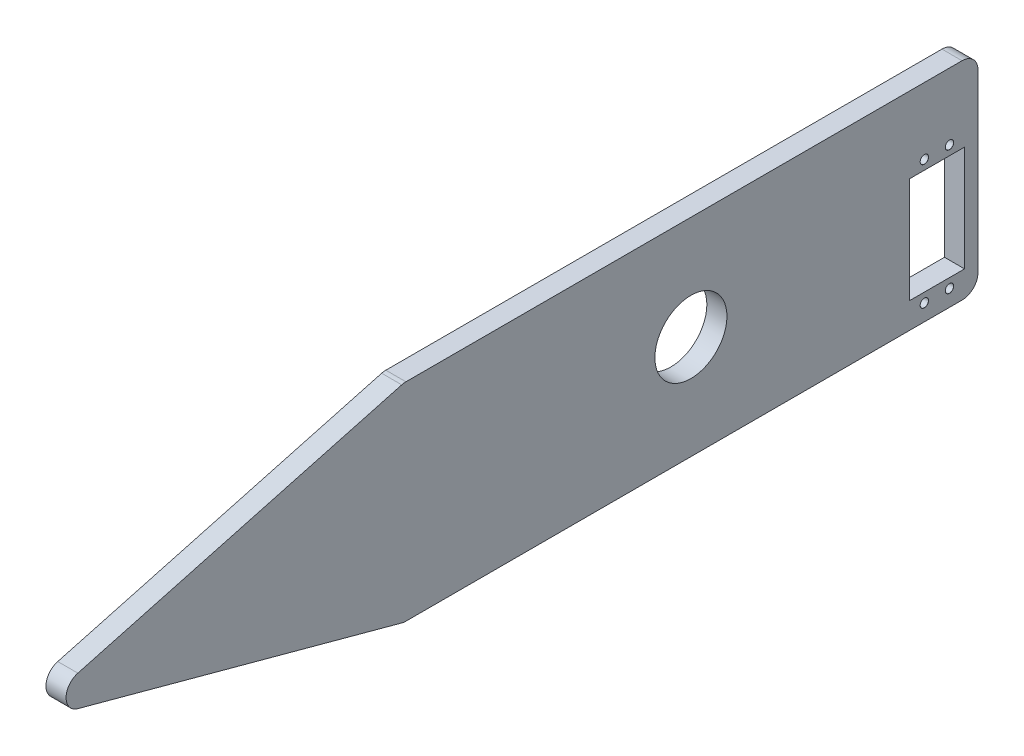
ISO-10303-21;
HEADER;
FILE_DESCRIPTION(('STEP AP214'),'2;1');
FILE_NAME('part.step','',(''),(''),'','','');
FILE_SCHEMA(('AUTOMOTIVE_DESIGN { 1 0 10303 214 1 1 1 1 }'));
ENDSEC;
DATA;
#1=APPLICATION_CONTEXT('core data for automotive mechanical design processes');
#2=APPLICATION_PROTOCOL_DEFINITION('international standard','automotive_design',2000,#1);
#3=PRODUCT_CONTEXT('',#1,'mechanical');
#4=PRODUCT('Part','Part','',(#3));
#5=PRODUCT_RELATED_PRODUCT_CATEGORY('part','',(#4));
#6=PRODUCT_DEFINITION_FORMATION('','',#4);
#7=PRODUCT_DEFINITION_CONTEXT('part definition',#1,'design');
#8=PRODUCT_DEFINITION('design','',#6,#7);
#9=PRODUCT_DEFINITION_SHAPE('','',#8);
#10=(LENGTH_UNIT() NAMED_UNIT(*) SI_UNIT(.MILLI.,.METRE.));
#11=(NAMED_UNIT(*) PLANE_ANGLE_UNIT() SI_UNIT($,.RADIAN.));
#12=(NAMED_UNIT(*) SI_UNIT($,.STERADIAN.) SOLID_ANGLE_UNIT());
#13=UNCERTAINTY_MEASURE_WITH_UNIT(LENGTH_MEASURE(1.E-05),#10,'distance_accuracy_value','');
#14=(GEOMETRIC_REPRESENTATION_CONTEXT(3) GLOBAL_UNCERTAINTY_ASSIGNED_CONTEXT((#13)) GLOBAL_UNIT_ASSIGNED_CONTEXT((#10,
#11,#12)) REPRESENTATION_CONTEXT('',''));
#15=CARTESIAN_POINT('',(0.,0.,0.));
#16=DIRECTION('',(0.,0.,1.));
#17=DIRECTION('',(1.,0.,0.));
#18=AXIS2_PLACEMENT_3D('',#15,#16,#17);
#19=CARTESIAN_POINT('',(4.0005,0.,0.));
#20=DIRECTION('',(1.,0.,0.));
#21=DIRECTION('',(0.,0.,-1.));
#22=AXIS2_PLACEMENT_3D('',#19,#20,#21);
#23=PLANE('',#22);
#24=DIRECTION('',(0.,1.,0.));
#25=VECTOR('',#24,1.);
#26=CARTESIAN_POINT('',(4.0005,-31.,-108.95));
#27=LINE('',#26,#25);
#28=CARTESIAN_POINT('',(4.0005,-31.,-108.95));
#29=VERTEX_POINT('',#28);
#30=CARTESIAN_POINT('',(4.0005,11.,-108.95));
#31=VERTEX_POINT('',#30);
#32=EDGE_CURVE('E53',#29,#31,#27,.T.);
#33=ORIENTED_EDGE('',*,*,#32,.F.);
#34=DIRECTION('',(0.,0.,-1.));
#35=VECTOR('',#34,1.);
#36=CARTESIAN_POINT('',(4.0005,-31.,-86.95));
#37=LINE('',#36,#35);
#38=CARTESIAN_POINT('',(4.0005,-31.,-86.95));
#39=VERTEX_POINT('',#38);
#40=EDGE_CURVE('E160',#39,#29,#37,.T.);
#41=ORIENTED_EDGE('',*,*,#40,.F.);
#42=DIRECTION('',(0.,-1.,0.));
#43=VECTOR('',#42,1.);
#44=CARTESIAN_POINT('',(4.0005,11.,-86.95));
#45=LINE('',#44,#43);
#46=CARTESIAN_POINT('',(4.0005,11.,-86.95));
#47=VERTEX_POINT('',#46);
#48=EDGE_CURVE('E159',#47,#39,#45,.T.);
#49=ORIENTED_EDGE('',*,*,#48,.F.);
#50=DIRECTION('',(0.,0.,1.));
#51=VECTOR('',#50,1.);
#52=CARTESIAN_POINT('',(4.0005,11.,-108.95));
#53=LINE('',#52,#51);
#54=EDGE_CURVE('E167',#31,#47,#53,.T.);
#55=ORIENTED_EDGE('',*,*,#54,.F.);
#56=EDGE_LOOP('',(#33,#41,#49,#55));
#57=FACE_BOUND('',#56,.T.);
#58=CARTESIAN_POINT('',(4.0005,-34.75,-92.95));
#59=DIRECTION('',(1.,0.,0.));
#60=DIRECTION('',(0.,0.,-1.));
#61=AXIS2_PLACEMENT_3D('',#58,#59,#60);
#62=CIRCLE('',#61,1.675);
#63=CARTESIAN_POINT('',(4.0005,-34.75,-94.625));
#64=VERTEX_POINT('',#63);
#65=EDGE_CURVE('E175',#64,#64,#62,.T.);
#66=ORIENTED_EDGE('',*,*,#65,.F.);
#67=EDGE_LOOP('',(#66));
#68=FACE_BOUND('',#67,.T.);
#69=CARTESIAN_POINT('',(4.0005,-34.75,-102.95));
#70=DIRECTION('',(1.,0.,0.));
#71=DIRECTION('',(0.,0.,-1.));
#72=AXIS2_PLACEMENT_3D('',#69,#70,#71);
#73=CIRCLE('',#72,1.675);
#74=CARTESIAN_POINT('',(4.0005,-34.75,-104.625));
#75=VERTEX_POINT('',#74);
#76=EDGE_CURVE('E184',#75,#75,#73,.T.);
#77=ORIENTED_EDGE('',*,*,#76,.F.);
#78=EDGE_LOOP('',(#77));
#79=FACE_BOUND('',#78,.T.);
#80=CARTESIAN_POINT('',(4.0005,14.75,-92.95));
#81=DIRECTION('',(1.,0.,0.));
#82=DIRECTION('',(0.,0.,-1.));
#83=AXIS2_PLACEMENT_3D('',#80,#81,#82);
#84=CIRCLE('',#83,1.675);
#85=CARTESIAN_POINT('',(4.0005,14.75,-94.625));
#86=VERTEX_POINT('',#85);
#87=EDGE_CURVE('E194',#86,#86,#84,.T.);
#88=ORIENTED_EDGE('',*,*,#87,.F.);
#89=EDGE_LOOP('',(#88));
#90=FACE_BOUND('',#89,.T.);
#91=CARTESIAN_POINT('',(4.0005,14.75,-102.95));
#92=DIRECTION('',(1.,0.,0.));
#93=DIRECTION('',(0.,0.,-1.));
#94=AXIS2_PLACEMENT_3D('',#91,#92,#93);
#95=CIRCLE('',#94,1.675);
#96=CARTESIAN_POINT('',(4.0005,14.75,-104.625));
#97=VERTEX_POINT('',#96);
#98=EDGE_CURVE('E205',#97,#97,#95,.T.);
#99=ORIENTED_EDGE('',*,*,#98,.F.);
#100=EDGE_LOOP('',(#99));
#101=FACE_BOUND('',#100,.T.);
#102=DIRECTION('',(0.,1.,0.));
#103=VECTOR('',#102,1.);
#104=CARTESIAN_POINT('',(4.0005,-41.275,-114.3));
#105=LINE('',#104,#103);
#106=CARTESIAN_POINT('',(4.0005,-34.925,-114.3));
#107=VERTEX_POINT('',#106);
#108=CARTESIAN_POINT('',(4.0005,34.925,-114.3));
#109=VERTEX_POINT('',#108);
#110=EDGE_CURVE('E223',#107,#109,#105,.T.);
#111=ORIENTED_EDGE('',*,*,#110,.T.);
#112=CARTESIAN_POINT('',(4.0005,34.925,-107.95));
#113=DIRECTION('',(1.,0.,0.));
#114=DIRECTION('',(0.,0.,-1.));
#115=AXIS2_PLACEMENT_3D('',#112,#113,#114);
#116=CIRCLE('',#115,6.35);
#117=CARTESIAN_POINT('',(4.0005,41.275,-107.95));
#118=VERTEX_POINT('',#117);
#119=EDGE_CURVE('E274',#109,#118,#116,.T.);
#120=ORIENTED_EDGE('',*,*,#119,.T.);
#121=DIRECTION('',(0.,0.,1.));
#122=VECTOR('',#121,1.);
#123=CARTESIAN_POINT('',(4.0005,41.275,-114.3));
#124=LINE('',#123,#122);
#125=CARTESIAN_POINT('',(4.0005,41.275,113.455319562879));
#126=VERTEX_POINT('',#125);
#127=EDGE_CURVE('E227',#118,#126,#124,.T.);
#128=ORIENTED_EDGE('',*,*,#127,.T.);
#129=CARTESIAN_POINT('',(4.0005,34.925,113.455319562879));
#130=DIRECTION('',(1.,0.,0.));
#131=DIRECTION('',(0.,0.,-1.));
#132=AXIS2_PLACEMENT_3D('',#129,#130,#131);
#133=CIRCLE('',#132,6.35);
#134=CARTESIAN_POINT('',(4.0005,41.0541874616917,115.115307833754));
#135=VERTEX_POINT('',#134);
#136=EDGE_CURVE('E270',#126,#135,#133,.T.);
#137=ORIENTED_EDGE('',*,*,#136,.T.);
#138=DIRECTION('',(0.,-0.261415475728318,0.965226371919944));
#139=VECTOR('',#138,1.);
#140=CARTESIAN_POINT('',(4.0005,41.275,114.3));
#141=LINE('',#140,#139);
#142=CARTESIAN_POINT('',(4.0005,6.12918746169166,244.0691539876));
#143=VERTEX_POINT('',#142);
#144=EDGE_CURVE('E231',#135,#143,#141,.T.);
#145=ORIENTED_EDGE('',*,*,#144,.T.);
#146=CARTESIAN_POINT('',(4.0005,0.,242.409165716725));
#147=DIRECTION('',(1.,0.,0.));
#148=DIRECTION('',(0.,0.,-1.));
#149=AXIS2_PLACEMENT_3D('',#146,#147,#148);
#150=CIRCLE('',#149,6.35);
#151=CARTESIAN_POINT('',(4.0005,-6.12918746169163,244.0691539876));
#152=VERTEX_POINT('',#151);
#153=EDGE_CURVE('E271',#143,#152,#150,.T.);
#154=ORIENTED_EDGE('',*,*,#153,.T.);
#155=DIRECTION('',(0.,-0.261415475728318,-0.965226371919944));
#156=VECTOR('',#155,1.);
#157=CARTESIAN_POINT('',(4.0005,0.,266.7));
#158=LINE('',#157,#156);
#159=CARTESIAN_POINT('',(4.0005,-41.0541874616916,115.115307833754));
#160=VERTEX_POINT('',#159);
#161=EDGE_CURVE('E217',#152,#160,#158,.T.);
#162=ORIENTED_EDGE('',*,*,#161,.T.);
#163=CARTESIAN_POINT('',(4.0005,-34.925,113.455319562879));
#164=DIRECTION('',(1.,0.,0.));
#165=DIRECTION('',(0.,0.,-1.));
#166=AXIS2_PLACEMENT_3D('',#163,#164,#165);
#167=CIRCLE('',#166,6.35);
#168=CARTESIAN_POINT('',(4.0005,-41.275,113.455319562879));
#169=VERTEX_POINT('',#168);
#170=EDGE_CURVE('E267',#160,#169,#167,.T.);
#171=ORIENTED_EDGE('',*,*,#170,.T.);
#172=DIRECTION('',(0.,0.,-1.));
#173=VECTOR('',#172,1.);
#174=CARTESIAN_POINT('',(4.0005,-41.275,114.3));
#175=LINE('',#174,#173);
#176=CARTESIAN_POINT('',(4.0005,-41.275,-107.95));
#177=VERTEX_POINT('',#176);
#178=EDGE_CURVE('E222',#169,#177,#175,.T.);
#179=ORIENTED_EDGE('',*,*,#178,.T.);
#180=CARTESIAN_POINT('',(4.0005,-34.925,-107.95));
#181=DIRECTION('',(1.,0.,0.));
#182=DIRECTION('',(0.,0.,-1.));
#183=AXIS2_PLACEMENT_3D('',#180,#181,#182);
#184=CIRCLE('',#183,6.35);
#185=EDGE_CURVE('E272',#177,#107,#184,.T.);
#186=ORIENTED_EDGE('',*,*,#185,.T.);
#187=EDGE_LOOP('',(#111,#120,#128,#137,#145,#154,#162,#171,#179,#186));
#188=FACE_BOUND('',#187,.T.);
#189=CARTESIAN_POINT('',(4.0005,0.,0.));
#190=DIRECTION('',(1.,0.,0.));
#191=DIRECTION('',(0.,0.,-1.));
#192=AXIS2_PLACEMENT_3D('',#189,#190,#191);
#193=CIRCLE('',#192,14.351);
#194=CARTESIAN_POINT('',(4.0005,0.,-14.351));
#195=VERTEX_POINT('',#194);
#196=EDGE_CURVE('E215',#195,#195,#193,.T.);
#197=ORIENTED_EDGE('',*,*,#196,.F.);
#198=EDGE_LOOP('',(#197));
#199=FACE_BOUND('',#198,.T.);
#200=ADVANCED_FACE('F39',(#57,#68,#79,#90,#101,#188,#199),#23,.T.);
#201=CARTESIAN_POINT('',(-4.0005,0.,0.));
#202=DIRECTION('',(1.,0.,0.));
#203=DIRECTION('',(0.,0.,-1.));
#204=AXIS2_PLACEMENT_3D('',#201,#202,#203);
#205=PLANE('',#204);
#206=DIRECTION('',(0.,0.,-1.));
#207=VECTOR('',#206,1.);
#208=CARTESIAN_POINT('',(-4.0005,-31.,-86.95));
#209=LINE('',#208,#207);
#210=CARTESIAN_POINT('',(-4.0005,-31.,-86.95));
#211=VERTEX_POINT('',#210);
#212=CARTESIAN_POINT('',(-4.0005,-31.,-108.95));
#213=VERTEX_POINT('',#212);
#214=EDGE_CURVE('E150',#211,#213,#209,.T.);
#215=ORIENTED_EDGE('',*,*,#214,.T.);
#216=DIRECTION('',(0.,1.,0.));
#217=VECTOR('',#216,1.);
#218=CARTESIAN_POINT('',(-4.0005,-31.,-108.95));
#219=LINE('',#218,#217);
#220=CARTESIAN_POINT('',(-4.0005,11.,-108.95));
#221=VERTEX_POINT('',#220);
#222=EDGE_CURVE('E143',#213,#221,#219,.T.);
#223=ORIENTED_EDGE('',*,*,#222,.T.);
#224=DIRECTION('',(0.,0.,1.));
#225=VECTOR('',#224,1.);
#226=CARTESIAN_POINT('',(-4.0005,11.,-108.95));
#227=LINE('',#226,#225);
#228=CARTESIAN_POINT('',(-4.0005,11.,-86.95));
#229=VERTEX_POINT('',#228);
#230=EDGE_CURVE('E147',#221,#229,#227,.T.);
#231=ORIENTED_EDGE('',*,*,#230,.T.);
#232=DIRECTION('',(0.,-1.,0.));
#233=VECTOR('',#232,1.);
#234=CARTESIAN_POINT('',(-4.0005,11.,-86.95));
#235=LINE('',#234,#233);
#236=EDGE_CURVE('E65',#229,#211,#235,.T.);
#237=ORIENTED_EDGE('',*,*,#236,.T.);
#238=EDGE_LOOP('',(#215,#223,#231,#237));
#239=FACE_BOUND('',#238,.T.);
#240=CARTESIAN_POINT('',(-4.0005,-34.75,-92.95));
#241=DIRECTION('',(1.,0.,0.));
#242=DIRECTION('',(0.,0.,-1.));
#243=AXIS2_PLACEMENT_3D('',#240,#241,#242);
#244=CIRCLE('',#243,1.65);
#245=CARTESIAN_POINT('',(-4.0005,-34.75,-94.6));
#246=VERTEX_POINT('',#245);
#247=EDGE_CURVE('E182',#246,#246,#244,.T.);
#248=ORIENTED_EDGE('',*,*,#247,.T.);
#249=EDGE_LOOP('',(#248));
#250=FACE_BOUND('',#249,.T.);
#251=CARTESIAN_POINT('',(-4.0005,-34.75,-102.95));
#252=DIRECTION('',(1.,0.,0.));
#253=DIRECTION('',(0.,0.,-1.));
#254=AXIS2_PLACEMENT_3D('',#251,#252,#253);
#255=CIRCLE('',#254,1.65);
#256=CARTESIAN_POINT('',(-4.0005,-34.75,-104.6));
#257=VERTEX_POINT('',#256);
#258=EDGE_CURVE('E189',#257,#257,#255,.T.);
#259=ORIENTED_EDGE('',*,*,#258,.T.);
#260=EDGE_LOOP('',(#259));
#261=FACE_BOUND('',#260,.T.);
#262=CARTESIAN_POINT('',(-4.0005,14.75,-92.95));
#263=DIRECTION('',(1.,0.,0.));
#264=DIRECTION('',(0.,0.,-1.));
#265=AXIS2_PLACEMENT_3D('',#262,#263,#264);
#266=CIRCLE('',#265,1.65);
#267=CARTESIAN_POINT('',(-4.0005,14.75,-94.6));
#268=VERTEX_POINT('',#267);
#269=EDGE_CURVE('E200',#268,#268,#266,.T.);
#270=ORIENTED_EDGE('',*,*,#269,.T.);
#271=EDGE_LOOP('',(#270));
#272=FACE_BOUND('',#271,.T.);
#273=CARTESIAN_POINT('',(-4.0005,14.75,-102.95));
#274=DIRECTION('',(1.,0.,0.));
#275=DIRECTION('',(0.,0.,-1.));
#276=AXIS2_PLACEMENT_3D('',#273,#274,#275);
#277=CIRCLE('',#276,1.65);
#278=CARTESIAN_POINT('',(-4.0005,14.75,-104.6));
#279=VERTEX_POINT('',#278);
#280=EDGE_CURVE('E208',#279,#279,#277,.T.);
#281=ORIENTED_EDGE('',*,*,#280,.T.);
#282=EDGE_LOOP('',(#281));
#283=FACE_BOUND('',#282,.T.);
#284=DIRECTION('',(0.,0.,1.));
#285=VECTOR('',#284,1.);
#286=CARTESIAN_POINT('',(-4.0005,41.275,-114.3));
#287=LINE('',#286,#285);
#288=CARTESIAN_POINT('',(-4.0005,41.275,-107.95));
#289=VERTEX_POINT('',#288);
#290=CARTESIAN_POINT('',(-4.0005,41.275,113.455319562879));
#291=VERTEX_POINT('',#290);
#292=EDGE_CURVE('E242',#289,#291,#287,.T.);
#293=ORIENTED_EDGE('',*,*,#292,.F.);
#294=CARTESIAN_POINT('',(-4.0005,34.925,-107.95));
#295=DIRECTION('',(1.,0.,0.));
#296=DIRECTION('',(0.,0.,-1.));
#297=AXIS2_PLACEMENT_3D('',#294,#295,#296);
#298=CIRCLE('',#297,6.35);
#299=CARTESIAN_POINT('',(-4.0005,34.925,-114.3));
#300=VERTEX_POINT('',#299);
#301=EDGE_CURVE('E257',#289,#300,#298,.F.);
#302=ORIENTED_EDGE('',*,*,#301,.T.);
#303=DIRECTION('',(0.,1.,0.));
#304=VECTOR('',#303,1.);
#305=CARTESIAN_POINT('',(-4.0005,-41.275,-114.3));
#306=LINE('',#305,#304);
#307=CARTESIAN_POINT('',(-4.0005,-34.925,-114.3));
#308=VERTEX_POINT('',#307);
#309=EDGE_CURVE('E238',#308,#300,#306,.T.);
#310=ORIENTED_EDGE('',*,*,#309,.F.);
#311=CARTESIAN_POINT('',(-4.0005,-34.925,-107.95));
#312=DIRECTION('',(1.,0.,0.));
#313=DIRECTION('',(0.,0.,-1.));
#314=AXIS2_PLACEMENT_3D('',#311,#312,#313);
#315=CIRCLE('',#314,6.35);
#316=CARTESIAN_POINT('',(-4.0005,-41.275,-107.95));
#317=VERTEX_POINT('',#316);
#318=EDGE_CURVE('E256',#308,#317,#315,.F.);
#319=ORIENTED_EDGE('',*,*,#318,.T.);
#320=DIRECTION('',(0.,0.,-1.));
#321=VECTOR('',#320,1.);
#322=CARTESIAN_POINT('',(-4.0005,-41.275,114.3));
#323=LINE('',#322,#321);
#324=CARTESIAN_POINT('',(-4.0005,-41.275,113.455319562879));
#325=VERTEX_POINT('',#324);
#326=EDGE_CURVE('E240',#325,#317,#323,.T.);
#327=ORIENTED_EDGE('',*,*,#326,.F.);
#328=CARTESIAN_POINT('',(-4.0005,-34.925,113.455319562879));
#329=DIRECTION('',(1.,0.,0.));
#330=DIRECTION('',(0.,0.,-1.));
#331=AXIS2_PLACEMENT_3D('',#328,#329,#330);
#332=CIRCLE('',#331,6.35);
#333=CARTESIAN_POINT('',(-4.0005,-41.0541874616916,115.115307833754));
#334=VERTEX_POINT('',#333);
#335=EDGE_CURVE('E255',#325,#334,#332,.F.);
#336=ORIENTED_EDGE('',*,*,#335,.T.);
#337=DIRECTION('',(0.,-0.261415475728318,-0.965226371919944));
#338=VECTOR('',#337,1.);
#339=CARTESIAN_POINT('',(-4.0005,0.,266.7));
#340=LINE('',#339,#338);
#341=CARTESIAN_POINT('',(-4.0005,-6.12918746169163,244.0691539876));
#342=VERTEX_POINT('',#341);
#343=EDGE_CURVE('E214',#342,#334,#340,.T.);
#344=ORIENTED_EDGE('',*,*,#343,.F.);
#345=CARTESIAN_POINT('',(-4.0005,0.,242.409165716725));
#346=DIRECTION('',(1.,0.,0.));
#347=DIRECTION('',(0.,0.,-1.));
#348=AXIS2_PLACEMENT_3D('',#345,#346,#347);
#349=CIRCLE('',#348,6.35);
#350=CARTESIAN_POINT('',(-4.0005,6.12918746169166,244.0691539876));
#351=VERTEX_POINT('',#350);
#352=EDGE_CURVE('E258',#342,#351,#349,.F.);
#353=ORIENTED_EDGE('',*,*,#352,.T.);
#354=DIRECTION('',(0.,-0.261415475728318,0.965226371919944));
#355=VECTOR('',#354,1.);
#356=CARTESIAN_POINT('',(-4.0005,41.275,114.3));
#357=LINE('',#356,#355);
#358=CARTESIAN_POINT('',(-4.0005,41.0541874616917,115.115307833754));
#359=VERTEX_POINT('',#358);
#360=EDGE_CURVE('E225',#359,#351,#357,.T.);
#361=ORIENTED_EDGE('',*,*,#360,.F.);
#362=CARTESIAN_POINT('',(-4.0005,34.925,113.455319562879));
#363=DIRECTION('',(1.,0.,0.));
#364=DIRECTION('',(0.,0.,-1.));
#365=AXIS2_PLACEMENT_3D('',#362,#363,#364);
#366=CIRCLE('',#365,6.35);
#367=EDGE_CURVE('E252',#359,#291,#366,.F.);
#368=ORIENTED_EDGE('',*,*,#367,.T.);
#369=EDGE_LOOP('',(#293,#302,#310,#319,#327,#336,#344,#353,#361,#368));
#370=FACE_BOUND('',#369,.T.);
#371=CARTESIAN_POINT('',(-4.0005,0.,0.));
#372=DIRECTION('',(1.,0.,0.));
#373=DIRECTION('',(0.,0.,-1.));
#374=AXIS2_PLACEMENT_3D('',#371,#372,#373);
#375=CIRCLE('',#374,14.351);
#376=CARTESIAN_POINT('',(-4.0005,0.,-14.351));
#377=VERTEX_POINT('',#376);
#378=EDGE_CURVE('E211',#377,#377,#375,.T.);
#379=ORIENTED_EDGE('',*,*,#378,.T.);
#380=EDGE_LOOP('',(#379));
#381=FACE_BOUND('',#380,.T.);
#382=ADVANCED_FACE('F152',(#239,#250,#261,#272,#283,#370,#381),#205,.F.);
#383=CARTESIAN_POINT('',(4.0005,0.,266.7));
#384=DIRECTION('',(0.,0.965226371919944,-0.261415475728318));
#385=DIRECTION('',(0.,0.261415475728318,0.965226371919944));
#386=AXIS2_PLACEMENT_3D('',#383,#384,#385);
#387=PLANE('',#386);
#388=ORIENTED_EDGE('',*,*,#161,.F.);
#389=DIRECTION('',(-1.,0.,0.));
#390=VECTOR('',#389,1.);
#391=CARTESIAN_POINT('',(4.0005,-6.12918746169163,244.0691539876));
#392=LINE('',#391,#390);
#393=EDGE_CURVE('E283',#152,#342,#392,.T.);
#394=ORIENTED_EDGE('',*,*,#393,.T.);
#395=ORIENTED_EDGE('',*,*,#343,.T.);
#396=DIRECTION('',(-1.,0.,0.));
#397=VECTOR('',#396,1.);
#398=CARTESIAN_POINT('',(4.0005,-41.0541874616916,115.115307833754));
#399=LINE('',#398,#397);
#400=EDGE_CURVE('E285',#334,#160,#399,.F.);
#401=ORIENTED_EDGE('',*,*,#400,.T.);
#402=EDGE_LOOP('',(#388,#394,#395,#401));
#403=FACE_BOUND('',#402,.T.);
#404=ADVANCED_FACE('F305',(#403),#387,.F.);
#405=CARTESIAN_POINT('',(4.0005,-41.275,114.3));
#406=DIRECTION('',(0.,1.,0.));
#407=DIRECTION('',(0.,0.,1.));
#408=AXIS2_PLACEMENT_3D('',#405,#406,#407);
#409=PLANE('',#408);
#410=ORIENTED_EDGE('',*,*,#326,.T.);
#411=DIRECTION('',(-1.,0.,0.));
#412=VECTOR('',#411,1.);
#413=CARTESIAN_POINT('',(4.0005,-41.275,-107.95));
#414=LINE('',#413,#412);
#415=EDGE_CURVE('E278',#317,#177,#414,.F.);
#416=ORIENTED_EDGE('',*,*,#415,.T.);
#417=ORIENTED_EDGE('',*,*,#178,.F.);
#418=DIRECTION('',(-1.,0.,0.));
#419=VECTOR('',#418,1.);
#420=CARTESIAN_POINT('',(4.0005,-41.275,113.455319562879));
#421=LINE('',#420,#419);
#422=EDGE_CURVE('E280',#169,#325,#421,.T.);
#423=ORIENTED_EDGE('',*,*,#422,.T.);
#424=EDGE_LOOP('',(#410,#416,#417,#423));
#425=FACE_BOUND('',#424,.T.);
#426=ADVANCED_FACE('F316',(#425),#409,.F.);
#427=CARTESIAN_POINT('',(4.0005,-41.275,-114.3));
#428=DIRECTION('',(0.,0.,1.));
#429=DIRECTION('',(0.,-1.,0.));
#430=AXIS2_PLACEMENT_3D('',#427,#428,#429);
#431=PLANE('',#430);
#432=ORIENTED_EDGE('',*,*,#309,.T.);
#433=DIRECTION('',(-1.,0.,0.));
#434=VECTOR('',#433,1.);
#435=CARTESIAN_POINT('',(4.0005,34.925,-114.3));
#436=LINE('',#435,#434);
#437=EDGE_CURVE('E264',#300,#109,#436,.F.);
#438=ORIENTED_EDGE('',*,*,#437,.T.);
#439=ORIENTED_EDGE('',*,*,#110,.F.);
#440=DIRECTION('',(-1.,0.,0.));
#441=VECTOR('',#440,1.);
#442=CARTESIAN_POINT('',(4.0005,-34.925,-114.3));
#443=LINE('',#442,#441);
#444=EDGE_CURVE('E265',#107,#308,#443,.T.);
#445=ORIENTED_EDGE('',*,*,#444,.T.);
#446=EDGE_LOOP('',(#432,#438,#439,#445));
#447=FACE_BOUND('',#446,.T.);
#448=ADVANCED_FACE('F324',(#447),#431,.F.);
#449=CARTESIAN_POINT('',(4.0005,41.275,-114.3));
#450=DIRECTION('',(0.,-1.,0.));
#451=DIRECTION('',(0.,0.,-1.));
#452=AXIS2_PLACEMENT_3D('',#449,#450,#451);
#453=PLANE('',#452);
#454=ORIENTED_EDGE('',*,*,#127,.F.);
#455=DIRECTION('',(-1.,0.,0.));
#456=VECTOR('',#455,1.);
#457=CARTESIAN_POINT('',(4.0005,41.275,-107.95));
#458=LINE('',#457,#456);
#459=EDGE_CURVE('E248',#118,#289,#458,.T.);
#460=ORIENTED_EDGE('',*,*,#459,.T.);
#461=ORIENTED_EDGE('',*,*,#292,.T.);
#462=DIRECTION('',(-1.,0.,0.));
#463=VECTOR('',#462,1.);
#464=CARTESIAN_POINT('',(4.0005,41.275,113.455319562879));
#465=LINE('',#464,#463);
#466=EDGE_CURVE('E233',#291,#126,#465,.F.);
#467=ORIENTED_EDGE('',*,*,#466,.T.);
#468=EDGE_LOOP('',(#454,#460,#461,#467));
#469=FACE_BOUND('',#468,.T.);
#470=ADVANCED_FACE('F334',(#469),#453,.F.);
#471=CARTESIAN_POINT('',(4.0005,41.275,114.3));
#472=DIRECTION('',(0.,-0.965226371919944,-0.261415475728318));
#473=DIRECTION('',(0.,0.261415475728318,-0.965226371919944));
#474=AXIS2_PLACEMENT_3D('',#471,#472,#473);
#475=PLANE('',#474);
#476=ORIENTED_EDGE('',*,*,#360,.T.);
#477=DIRECTION('',(-1.,0.,0.));
#478=VECTOR('',#477,1.);
#479=CARTESIAN_POINT('',(4.0005,6.12918746169167,244.0691539876));
#480=LINE('',#479,#478);
#481=EDGE_CURVE('E11',#351,#143,#480,.F.);
#482=ORIENTED_EDGE('',*,*,#481,.T.);
#483=ORIENTED_EDGE('',*,*,#144,.F.);
#484=DIRECTION('',(-1.,0.,0.));
#485=VECTOR('',#484,1.);
#486=CARTESIAN_POINT('',(4.0005,41.0541874616917,115.115307833754));
#487=LINE('',#486,#485);
#488=EDGE_CURVE('E50',#135,#359,#487,.T.);
#489=ORIENTED_EDGE('',*,*,#488,.T.);
#490=EDGE_LOOP('',(#476,#482,#483,#489));
#491=FACE_BOUND('',#490,.T.);
#492=ADVANCED_FACE('F292',(#491),#475,.F.);
#493=CARTESIAN_POINT('',(4.0005,0.,0.));
#494=DIRECTION('',(-1.,0.,0.));
#495=DIRECTION('',(0.,0.,1.));
#496=AXIS2_PLACEMENT_3D('',#493,#494,#495);
#497=CYLINDRICAL_SURFACE('',#496,14.351);
#498=ORIENTED_EDGE('',*,*,#196,.T.);
#499=EDGE_LOOP('',(#498));
#500=FACE_BOUND('',#499,.T.);
#501=ORIENTED_EDGE('',*,*,#378,.F.);
#502=EDGE_LOOP('',(#501));
#503=FACE_BOUND('',#502,.T.);
#504=ADVANCED_FACE('F353',(#500,#503),#497,.F.);
#505=CARTESIAN_POINT('',(4.0005,34.925,-107.95));
#506=DIRECTION('',(-1.,0.,0.));
#507=DIRECTION('',(0.,0.,1.));
#508=AXIS2_PLACEMENT_3D('',#505,#506,#507);
#509=CYLINDRICAL_SURFACE('',#508,6.35);
#510=ORIENTED_EDGE('',*,*,#119,.F.);
#511=ORIENTED_EDGE('',*,*,#437,.F.);
#512=ORIENTED_EDGE('',*,*,#301,.F.);
#513=ORIENTED_EDGE('',*,*,#459,.F.);
#514=EDGE_LOOP('',(#510,#511,#512,#513));
#515=FACE_BOUND('',#514,.T.);
#516=ADVANCED_FACE('F332',(#515),#509,.T.);
#517=CARTESIAN_POINT('',(4.0005,-34.925,-107.95));
#518=DIRECTION('',(-1.,0.,0.));
#519=DIRECTION('',(0.,0.,1.));
#520=AXIS2_PLACEMENT_3D('',#517,#518,#519);
#521=CYLINDRICAL_SURFACE('',#520,6.35);
#522=ORIENTED_EDGE('',*,*,#185,.F.);
#523=ORIENTED_EDGE('',*,*,#415,.F.);
#524=ORIENTED_EDGE('',*,*,#318,.F.);
#525=ORIENTED_EDGE('',*,*,#444,.F.);
#526=EDGE_LOOP('',(#522,#523,#524,#525));
#527=FACE_BOUND('',#526,.T.);
#528=ADVANCED_FACE('F325',(#527),#521,.T.);
#529=CARTESIAN_POINT('',(4.0005,0.,242.409165716725));
#530=DIRECTION('',(-1.,0.,0.));
#531=DIRECTION('',(0.,0.,1.));
#532=AXIS2_PLACEMENT_3D('',#529,#530,#531);
#533=CYLINDRICAL_SURFACE('',#532,6.35);
#534=ORIENTED_EDGE('',*,*,#153,.F.);
#535=ORIENTED_EDGE('',*,*,#481,.F.);
#536=ORIENTED_EDGE('',*,*,#352,.F.);
#537=ORIENTED_EDGE('',*,*,#393,.F.);
#538=EDGE_LOOP('',(#534,#535,#536,#537));
#539=FACE_BOUND('',#538,.T.);
#540=ADVANCED_FACE('F302',(#539),#533,.T.);
#541=CARTESIAN_POINT('',(4.0005,-34.925,113.455319562879));
#542=DIRECTION('',(-1.,0.,0.));
#543=DIRECTION('',(0.,0.,1.));
#544=AXIS2_PLACEMENT_3D('',#541,#542,#543);
#545=CYLINDRICAL_SURFACE('',#544,6.35);
#546=ORIENTED_EDGE('',*,*,#170,.F.);
#547=ORIENTED_EDGE('',*,*,#400,.F.);
#548=ORIENTED_EDGE('',*,*,#335,.F.);
#549=ORIENTED_EDGE('',*,*,#422,.F.);
#550=EDGE_LOOP('',(#546,#547,#548,#549));
#551=FACE_BOUND('',#550,.T.);
#552=ADVANCED_FACE('F311',(#551),#545,.T.);
#553=CARTESIAN_POINT('',(4.0005,34.925,113.455319562879));
#554=DIRECTION('',(-1.,0.,0.));
#555=DIRECTION('',(0.,0.,1.));
#556=AXIS2_PLACEMENT_3D('',#553,#554,#555);
#557=CYLINDRICAL_SURFACE('',#556,6.35);
#558=ORIENTED_EDGE('',*,*,#136,.F.);
#559=ORIENTED_EDGE('',*,*,#466,.F.);
#560=ORIENTED_EDGE('',*,*,#367,.F.);
#561=ORIENTED_EDGE('',*,*,#488,.F.);
#562=EDGE_LOOP('',(#558,#559,#560,#561));
#563=FACE_BOUND('',#562,.T.);
#564=ADVANCED_FACE('F41',(#563),#557,.T.);
#565=CARTESIAN_POINT('',(4.0005,14.75,-102.95));
#566=DIRECTION('',(1.,0.,0.));
#567=DIRECTION('',(0.,0.,-1.));
#568=AXIS2_PLACEMENT_3D('',#565,#566,#567);
#569=CYLINDRICAL_SURFACE('',#568,1.65);
#570=ORIENTED_EDGE('',*,*,#280,.F.);
#571=EDGE_LOOP('',(#570));
#572=FACE_BOUND('',#571,.T.);
#573=CARTESIAN_POINT('',(3.9755,14.75,-102.95));
#574=DIRECTION('',(1.,0.,0.));
#575=DIRECTION('',(0.,0.,-1.));
#576=AXIS2_PLACEMENT_3D('',#573,#574,#575);
#577=CIRCLE('',#576,1.65);
#578=CARTESIAN_POINT('',(3.9755,14.75,-104.6));
#579=VERTEX_POINT('',#578);
#580=EDGE_CURVE('E202',#579,#579,#577,.T.);
#581=ORIENTED_EDGE('',*,*,#580,.T.);
#582=EDGE_LOOP('',(#581));
#583=FACE_BOUND('',#582,.T.);
#584=ADVANCED_FACE('F336',(#572,#583),#569,.F.);
#585=CARTESIAN_POINT('',(4.0005,14.75,-102.95));
#586=DIRECTION('',(1.,0.,0.));
#587=DIRECTION('',(0.,0.,-1.));
#588=AXIS2_PLACEMENT_3D('',#585,#586,#587);
#589=CONICAL_SURFACE('',#588,1.675,0.785398163397431);
#590=ORIENTED_EDGE('',*,*,#580,.F.);
#591=EDGE_LOOP('',(#590));
#592=FACE_BOUND('',#591,.T.);
#593=ORIENTED_EDGE('',*,*,#98,.T.);
#594=EDGE_LOOP('',(#593));
#595=FACE_BOUND('',#594,.T.);
#596=ADVANCED_FACE('F341',(#592,#595),#589,.F.);
#597=CARTESIAN_POINT('',(4.0005,14.75,-92.95));
#598=DIRECTION('',(1.,0.,0.));
#599=DIRECTION('',(0.,0.,-1.));
#600=AXIS2_PLACEMENT_3D('',#597,#598,#599);
#601=CYLINDRICAL_SURFACE('',#600,1.65);
#602=ORIENTED_EDGE('',*,*,#269,.F.);
#603=EDGE_LOOP('',(#602));
#604=FACE_BOUND('',#603,.T.);
#605=CARTESIAN_POINT('',(3.9755,14.75,-92.95));
#606=DIRECTION('',(1.,0.,0.));
#607=DIRECTION('',(0.,0.,-1.));
#608=AXIS2_PLACEMENT_3D('',#605,#606,#607);
#609=CIRCLE('',#608,1.65);
#610=CARTESIAN_POINT('',(3.9755,14.75,-94.6));
#611=VERTEX_POINT('',#610);
#612=EDGE_CURVE('E198',#611,#611,#609,.T.);
#613=ORIENTED_EDGE('',*,*,#612,.T.);
#614=EDGE_LOOP('',(#613));
#615=FACE_BOUND('',#614,.T.);
#616=ADVANCED_FACE('F400',(#604,#615),#601,.F.);
#617=CARTESIAN_POINT('',(4.0005,14.75,-92.95));
#618=DIRECTION('',(1.,0.,0.));
#619=DIRECTION('',(0.,0.,-1.));
#620=AXIS2_PLACEMENT_3D('',#617,#618,#619);
#621=CONICAL_SURFACE('',#620,1.675,0.785398163397431);
#622=ORIENTED_EDGE('',*,*,#612,.F.);
#623=EDGE_LOOP('',(#622));
#624=FACE_BOUND('',#623,.T.);
#625=ORIENTED_EDGE('',*,*,#87,.T.);
#626=EDGE_LOOP('',(#625));
#627=FACE_BOUND('',#626,.T.);
#628=ADVANCED_FACE('F409',(#624,#627),#621,.F.);
#629=CARTESIAN_POINT('',(4.0005,-34.75,-102.95));
#630=DIRECTION('',(1.,0.,0.));
#631=DIRECTION('',(0.,0.,-1.));
#632=AXIS2_PLACEMENT_3D('',#629,#630,#631);
#633=CYLINDRICAL_SURFACE('',#632,1.65);
#634=ORIENTED_EDGE('',*,*,#258,.F.);
#635=EDGE_LOOP('',(#634));
#636=FACE_BOUND('',#635,.T.);
#637=CARTESIAN_POINT('',(3.9755,-34.75,-102.95));
#638=DIRECTION('',(1.,0.,0.));
#639=DIRECTION('',(0.,0.,-1.));
#640=AXIS2_PLACEMENT_3D('',#637,#638,#639);
#641=CIRCLE('',#640,1.65);
#642=CARTESIAN_POINT('',(3.9755,-34.75,-104.6));
#643=VERTEX_POINT('',#642);
#644=EDGE_CURVE('E190',#643,#643,#641,.T.);
#645=ORIENTED_EDGE('',*,*,#644,.T.);
#646=EDGE_LOOP('',(#645));
#647=FACE_BOUND('',#646,.T.);
#648=ADVANCED_FACE('F419',(#636,#647),#633,.F.);
#649=CARTESIAN_POINT('',(4.0005,-34.75,-102.95));
#650=DIRECTION('',(1.,0.,0.));
#651=DIRECTION('',(0.,0.,-1.));
#652=AXIS2_PLACEMENT_3D('',#649,#650,#651);
#653=CONICAL_SURFACE('',#652,1.675,0.7853981633975);
#654=ORIENTED_EDGE('',*,*,#644,.F.);
#655=EDGE_LOOP('',(#654));
#656=FACE_BOUND('',#655,.T.);
#657=ORIENTED_EDGE('',*,*,#76,.T.);
#658=EDGE_LOOP('',(#657));
#659=FACE_BOUND('',#658,.T.);
#660=ADVANCED_FACE('F429',(#656,#659),#653,.F.);
#661=CARTESIAN_POINT('',(4.0005,-34.75,-92.95));
#662=DIRECTION('',(1.,0.,0.));
#663=DIRECTION('',(0.,0.,-1.));
#664=AXIS2_PLACEMENT_3D('',#661,#662,#663);
#665=CYLINDRICAL_SURFACE('',#664,1.65);
#666=ORIENTED_EDGE('',*,*,#247,.F.);
#667=EDGE_LOOP('',(#666));
#668=FACE_BOUND('',#667,.T.);
#669=CARTESIAN_POINT('',(3.9755,-34.75,-92.95));
#670=DIRECTION('',(1.,0.,0.));
#671=DIRECTION('',(0.,0.,-1.));
#672=AXIS2_PLACEMENT_3D('',#669,#670,#671);
#673=CIRCLE('',#672,1.65);
#674=CARTESIAN_POINT('',(3.9755,-34.75,-94.6));
#675=VERTEX_POINT('',#674);
#676=EDGE_CURVE('E179',#675,#675,#673,.T.);
#677=ORIENTED_EDGE('',*,*,#676,.T.);
#678=EDGE_LOOP('',(#677));
#679=FACE_BOUND('',#678,.T.);
#680=ADVANCED_FACE('F439',(#668,#679),#665,.F.);
#681=CARTESIAN_POINT('',(4.0005,-34.75,-92.95));
#682=DIRECTION('',(1.,0.,0.));
#683=DIRECTION('',(0.,0.,-1.));
#684=AXIS2_PLACEMENT_3D('',#681,#682,#683);
#685=CONICAL_SURFACE('',#684,1.675,0.7853981633975);
#686=ORIENTED_EDGE('',*,*,#676,.F.);
#687=EDGE_LOOP('',(#686));
#688=FACE_BOUND('',#687,.T.);
#689=ORIENTED_EDGE('',*,*,#65,.T.);
#690=EDGE_LOOP('',(#689));
#691=FACE_BOUND('',#690,.T.);
#692=ADVANCED_FACE('F449',(#688,#691),#685,.F.);
#693=CARTESIAN_POINT('',(-4.0005,-31.,-108.95));
#694=DIRECTION('',(0.,0.,-1.));
#695=DIRECTION('',(-1.,0.,0.));
#696=AXIS2_PLACEMENT_3D('',#693,#694,#695);
#697=PLANE('',#696);
#698=ORIENTED_EDGE('',*,*,#32,.T.);
#699=DIRECTION('',(1.,0.,0.));
#700=VECTOR('',#699,1.);
#701=CARTESIAN_POINT('',(-4.0005,11.,-108.95));
#702=LINE('',#701,#700);
#703=EDGE_CURVE('E137',#221,#31,#702,.T.);
#704=ORIENTED_EDGE('',*,*,#703,.F.);
#705=ORIENTED_EDGE('',*,*,#222,.F.);
#706=DIRECTION('',(1.,0.,0.));
#707=VECTOR('',#706,1.);
#708=CARTESIAN_POINT('',(-4.0005,-31.,-108.95));
#709=LINE('',#708,#707);
#710=EDGE_CURVE('E168',#213,#29,#709,.T.);
#711=ORIENTED_EDGE('',*,*,#710,.T.);
#712=EDGE_LOOP('',(#698,#704,#705,#711));
#713=FACE_BOUND('',#712,.T.);
#714=ADVANCED_FACE('F138',(#713),#697,.F.);
#715=CARTESIAN_POINT('',(-4.0005,-31.,-86.95));
#716=DIRECTION('',(0.,-1.,0.));
#717=DIRECTION('',(0.,0.,-1.));
#718=AXIS2_PLACEMENT_3D('',#715,#716,#717);
#719=PLANE('',#718);
#720=ORIENTED_EDGE('',*,*,#40,.T.);
#721=ORIENTED_EDGE('',*,*,#710,.F.);
#722=ORIENTED_EDGE('',*,*,#214,.F.);
#723=DIRECTION('',(1.,0.,0.));
#724=VECTOR('',#723,1.);
#725=CARTESIAN_POINT('',(-4.0005,-31.,-86.95));
#726=LINE('',#725,#724);
#727=EDGE_CURVE('E172',#211,#39,#726,.T.);
#728=ORIENTED_EDGE('',*,*,#727,.T.);
#729=EDGE_LOOP('',(#720,#721,#722,#728));
#730=FACE_BOUND('',#729,.T.);
#731=ADVANCED_FACE('F469',(#730),#719,.F.);
#732=CARTESIAN_POINT('',(-4.0005,11.,-86.95));
#733=DIRECTION('',(0.,0.,1.));
#734=DIRECTION('',(1.,0.,0.));
#735=AXIS2_PLACEMENT_3D('',#732,#733,#734);
#736=PLANE('',#735);
#737=ORIENTED_EDGE('',*,*,#48,.T.);
#738=ORIENTED_EDGE('',*,*,#727,.F.);
#739=ORIENTED_EDGE('',*,*,#236,.F.);
#740=DIRECTION('',(1.,0.,0.));
#741=VECTOR('',#740,1.);
#742=CARTESIAN_POINT('',(-4.0005,11.,-86.95));
#743=LINE('',#742,#741);
#744=EDGE_CURVE('E148',#229,#47,#743,.T.);
#745=ORIENTED_EDGE('',*,*,#744,.T.);
#746=EDGE_LOOP('',(#737,#738,#739,#745));
#747=FACE_BOUND('',#746,.T.);
#748=ADVANCED_FACE('F480',(#747),#736,.F.);
#749=CARTESIAN_POINT('',(-4.0005,11.,-108.95));
#750=DIRECTION('',(0.,1.,0.));
#751=DIRECTION('',(0.,0.,1.));
#752=AXIS2_PLACEMENT_3D('',#749,#750,#751);
#753=PLANE('',#752);
#754=ORIENTED_EDGE('',*,*,#54,.T.);
#755=ORIENTED_EDGE('',*,*,#744,.F.);
#756=ORIENTED_EDGE('',*,*,#230,.F.);
#757=ORIENTED_EDGE('',*,*,#703,.T.);
#758=EDGE_LOOP('',(#754,#755,#756,#757));
#759=FACE_BOUND('',#758,.T.);
#760=ADVANCED_FACE('F151',(#759),#753,.F.);
#761=CLOSED_SHELL('',(#200,#382,#404,#426,#448,#470,#492,#504,#516,#528,#540,#552,#564,#584,
#596,#616,#628,#648,#660,#680,#692,#714,#731,#748,#760));
#762=MANIFOLD_SOLID_BREP('B2',#761);
#763=ADVANCED_BREP_SHAPE_REPRESENTATION('',(#18,#762),#14);
#764=SHAPE_DEFINITION_REPRESENTATION(#9,#763);
ENDSEC;
END-ISO-10303-21;
